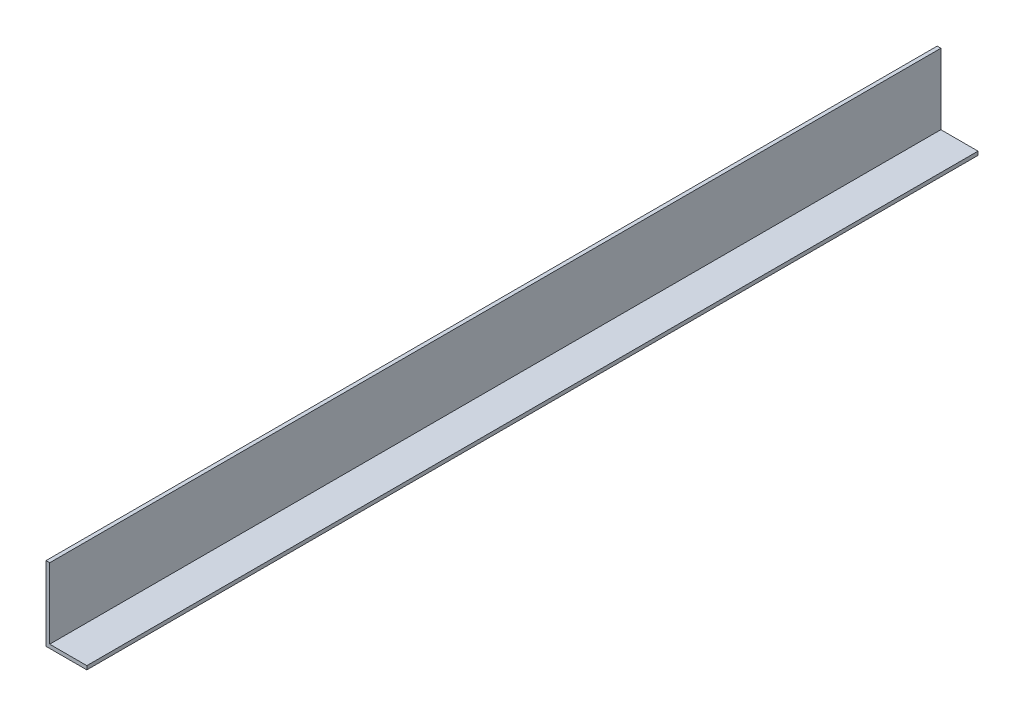
ISO-10303-21;
HEADER;
FILE_DESCRIPTION(('STEP AP214'),'2;1');
FILE_NAME('part.step','',(''),(''),'','','');
FILE_SCHEMA(('AUTOMOTIVE_DESIGN { 1 0 10303 214 1 1 1 1 }'));
ENDSEC;
DATA;
#1=APPLICATION_CONTEXT('core data for automotive mechanical design processes');
#2=APPLICATION_PROTOCOL_DEFINITION('international standard','automotive_design',2000,#1);
#3=PRODUCT_CONTEXT('',#1,'mechanical');
#4=PRODUCT('Part','Part','',(#3));
#5=PRODUCT_RELATED_PRODUCT_CATEGORY('part','',(#4));
#6=PRODUCT_DEFINITION_FORMATION('','',#4);
#7=PRODUCT_DEFINITION_CONTEXT('part definition',#1,'design');
#8=PRODUCT_DEFINITION('design','',#6,#7);
#9=PRODUCT_DEFINITION_SHAPE('','',#8);
#10=(LENGTH_UNIT() NAMED_UNIT(*) SI_UNIT(.MILLI.,.METRE.));
#11=(NAMED_UNIT(*) PLANE_ANGLE_UNIT() SI_UNIT($,.RADIAN.));
#12=(NAMED_UNIT(*) SI_UNIT($,.STERADIAN.) SOLID_ANGLE_UNIT());
#13=UNCERTAINTY_MEASURE_WITH_UNIT(LENGTH_MEASURE(1.E-05),#10,'distance_accuracy_value','');
#14=(GEOMETRIC_REPRESENTATION_CONTEXT(3) GLOBAL_UNCERTAINTY_ASSIGNED_CONTEXT((#13)) GLOBAL_UNIT_ASSIGNED_CONTEXT((#10,
#11,#12)) REPRESENTATION_CONTEXT('',''));
#15=CARTESIAN_POINT('',(0.,0.,0.));
#16=DIRECTION('',(0.,0.,1.));
#17=DIRECTION('',(1.,0.,0.));
#18=AXIS2_PLACEMENT_3D('',#15,#16,#17);
#19=CARTESIAN_POINT('',(11.,0.,240.));
#20=DIRECTION('',(0.,1.,0.));
#21=DIRECTION('',(-1.,0.,0.));
#22=AXIS2_PLACEMENT_3D('',#19,#20,#21);
#23=PLANE('',#22);
#24=DIRECTION('',(1.,0.,0.));
#25=VECTOR('',#24,1.);
#26=CARTESIAN_POINT('',(11.,0.,0.));
#27=LINE('',#26,#25);
#28=CARTESIAN_POINT('',(0.,0.,0.));
#29=VERTEX_POINT('',#28);
#30=CARTESIAN_POINT('',(11.,0.,0.));
#31=VERTEX_POINT('',#30);
#32=EDGE_CURVE('E117',#29,#31,#27,.T.);
#33=ORIENTED_EDGE('',*,*,#32,.T.);
#34=DIRECTION('',(0.,0.,-1.));
#35=VECTOR('',#34,1.);
#36=CARTESIAN_POINT('',(11.,0.,240.));
#37=LINE('',#36,#35);
#38=CARTESIAN_POINT('',(11.,0.,240.));
#39=VERTEX_POINT('',#38);
#40=EDGE_CURVE('E11',#39,#31,#37,.T.);
#41=ORIENTED_EDGE('',*,*,#40,.F.);
#42=DIRECTION('',(1.,0.,0.));
#43=VECTOR('',#42,1.);
#44=CARTESIAN_POINT('',(11.,0.,240.));
#45=LINE('',#44,#43);
#46=CARTESIAN_POINT('',(0.,0.,240.));
#47=VERTEX_POINT('',#46);
#48=EDGE_CURVE('E127',#47,#39,#45,.T.);
#49=ORIENTED_EDGE('',*,*,#48,.F.);
#50=DIRECTION('',(0.,0.,-1.));
#51=VECTOR('',#50,1.);
#52=CARTESIAN_POINT('',(0.,0.,240.));
#53=LINE('',#52,#51);
#54=EDGE_CURVE('E113',#47,#29,#53,.T.);
#55=ORIENTED_EDGE('',*,*,#54,.T.);
#56=EDGE_LOOP('',(#33,#41,#49,#55));
#57=FACE_BOUND('',#56,.T.);
#58=ADVANCED_FACE('F33',(#57),#23,.F.);
#59=CARTESIAN_POINT('',(11.,0.999999999999999,240.));
#60=DIRECTION('',(-1.,0.,0.));
#61=DIRECTION('',(0.,0.,1.));
#62=AXIS2_PLACEMENT_3D('',#59,#60,#61);
#63=PLANE('',#62);
#64=DIRECTION('',(0.,1.,0.));
#65=VECTOR('',#64,1.);
#66=CARTESIAN_POINT('',(11.,0.999999999999999,0.));
#67=LINE('',#66,#65);
#68=CARTESIAN_POINT('',(11.,0.999999999999999,0.));
#69=VERTEX_POINT('',#68);
#70=EDGE_CURVE('E120',#31,#69,#67,.T.);
#71=ORIENTED_EDGE('',*,*,#70,.T.);
#72=DIRECTION('',(0.,0.,-1.));
#73=VECTOR('',#72,1.);
#74=CARTESIAN_POINT('',(11.,0.999999999999999,240.));
#75=LINE('',#74,#73);
#76=CARTESIAN_POINT('',(11.,0.999999999999999,240.));
#77=VERTEX_POINT('',#76);
#78=EDGE_CURVE('E41',#77,#69,#75,.T.);
#79=ORIENTED_EDGE('',*,*,#78,.F.);
#80=DIRECTION('',(0.,1.,0.));
#81=VECTOR('',#80,1.);
#82=CARTESIAN_POINT('',(11.,0.999999999999999,240.));
#83=LINE('',#82,#81);
#84=EDGE_CURVE('E86',#39,#77,#83,.T.);
#85=ORIENTED_EDGE('',*,*,#84,.F.);
#86=ORIENTED_EDGE('',*,*,#40,.T.);
#87=EDGE_LOOP('',(#71,#79,#85,#86));
#88=FACE_BOUND('',#87,.T.);
#89=ADVANCED_FACE('F151',(#88),#63,.F.);
#90=CARTESIAN_POINT('',(1.,1.,240.));
#91=DIRECTION('',(0.,-1.,0.));
#92=DIRECTION('',(1.,0.,0.));
#93=AXIS2_PLACEMENT_3D('',#90,#91,#92);
#94=PLANE('',#93);
#95=DIRECTION('',(-1.,0.,0.));
#96=VECTOR('',#95,1.);
#97=CARTESIAN_POINT('',(1.,1.,0.));
#98=LINE('',#97,#96);
#99=CARTESIAN_POINT('',(1.,1.,0.));
#100=VERTEX_POINT('',#99);
#101=EDGE_CURVE('E122',#69,#100,#98,.T.);
#102=ORIENTED_EDGE('',*,*,#101,.T.);
#103=DIRECTION('',(0.,0.,-1.));
#104=VECTOR('',#103,1.);
#105=CARTESIAN_POINT('',(1.,1.,240.));
#106=LINE('',#105,#104);
#107=CARTESIAN_POINT('',(1.,1.,240.));
#108=VERTEX_POINT('',#107);
#109=EDGE_CURVE('E108',#108,#100,#106,.T.);
#110=ORIENTED_EDGE('',*,*,#109,.F.);
#111=DIRECTION('',(-1.,0.,0.));
#112=VECTOR('',#111,1.);
#113=CARTESIAN_POINT('',(1.,1.,240.));
#114=LINE('',#113,#112);
#115=EDGE_CURVE('E99',#77,#108,#114,.T.);
#116=ORIENTED_EDGE('',*,*,#115,.F.);
#117=ORIENTED_EDGE('',*,*,#78,.T.);
#118=EDGE_LOOP('',(#102,#110,#116,#117));
#119=FACE_BOUND('',#118,.T.);
#120=ADVANCED_FACE('F133',(#119),#94,.F.);
#121=CARTESIAN_POINT('',(1.,20.,240.));
#122=DIRECTION('',(-1.,0.,0.));
#123=DIRECTION('',(0.,-1.,0.));
#124=AXIS2_PLACEMENT_3D('',#121,#122,#123);
#125=PLANE('',#124);
#126=DIRECTION('',(0.,1.,0.));
#127=VECTOR('',#126,1.);
#128=CARTESIAN_POINT('',(1.,20.,0.));
#129=LINE('',#128,#127);
#130=CARTESIAN_POINT('',(1.,20.,0.));
#131=VERTEX_POINT('',#130);
#132=EDGE_CURVE('E107',#100,#131,#129,.T.);
#133=ORIENTED_EDGE('',*,*,#132,.T.);
#134=DIRECTION('',(0.,0.,-1.));
#135=VECTOR('',#134,1.);
#136=CARTESIAN_POINT('',(1.,20.,240.));
#137=LINE('',#136,#135);
#138=CARTESIAN_POINT('',(1.,20.,240.));
#139=VERTEX_POINT('',#138);
#140=EDGE_CURVE('E104',#139,#131,#137,.T.);
#141=ORIENTED_EDGE('',*,*,#140,.F.);
#142=DIRECTION('',(0.,1.,0.));
#143=VECTOR('',#142,1.);
#144=CARTESIAN_POINT('',(1.,20.,240.));
#145=LINE('',#144,#143);
#146=EDGE_CURVE('E93',#108,#139,#145,.T.);
#147=ORIENTED_EDGE('',*,*,#146,.F.);
#148=ORIENTED_EDGE('',*,*,#109,.T.);
#149=EDGE_LOOP('',(#133,#141,#147,#148));
#150=FACE_BOUND('',#149,.T.);
#151=ADVANCED_FACE('F105',(#150),#125,.F.);
#152=CARTESIAN_POINT('',(0.,20.,240.));
#153=DIRECTION('',(0.,-1.,0.));
#154=DIRECTION('',(0.,0.,-1.));
#155=AXIS2_PLACEMENT_3D('',#152,#153,#154);
#156=PLANE('',#155);
#157=DIRECTION('',(-1.,0.,0.));
#158=VECTOR('',#157,1.);
#159=CARTESIAN_POINT('',(0.,20.,0.));
#160=LINE('',#159,#158);
#161=CARTESIAN_POINT('',(0.,20.,0.));
#162=VERTEX_POINT('',#161);
#163=EDGE_CURVE('E72',#131,#162,#160,.T.);
#164=ORIENTED_EDGE('',*,*,#163,.T.);
#165=DIRECTION('',(0.,0.,-1.));
#166=VECTOR('',#165,1.);
#167=CARTESIAN_POINT('',(0.,20.,240.));
#168=LINE('',#167,#166);
#169=CARTESIAN_POINT('',(0.,20.,240.));
#170=VERTEX_POINT('',#169);
#171=EDGE_CURVE('E109',#170,#162,#168,.T.);
#172=ORIENTED_EDGE('',*,*,#171,.F.);
#173=DIRECTION('',(-1.,0.,0.));
#174=VECTOR('',#173,1.);
#175=CARTESIAN_POINT('',(0.,20.,240.));
#176=LINE('',#175,#174);
#177=EDGE_CURVE('E97',#139,#170,#176,.T.);
#178=ORIENTED_EDGE('',*,*,#177,.F.);
#179=ORIENTED_EDGE('',*,*,#140,.T.);
#180=EDGE_LOOP('',(#164,#172,#178,#179));
#181=FACE_BOUND('',#180,.T.);
#182=ADVANCED_FACE('F111',(#181),#156,.F.);
#183=CARTESIAN_POINT('',(0.,0.,240.));
#184=DIRECTION('',(1.,0.,0.));
#185=DIRECTION('',(0.,0.,-1.));
#186=AXIS2_PLACEMENT_3D('',#183,#184,#185);
#187=PLANE('',#186);
#188=DIRECTION('',(0.,-1.,0.));
#189=VECTOR('',#188,1.);
#190=CARTESIAN_POINT('',(0.,0.,0.));
#191=LINE('',#190,#189);
#192=EDGE_CURVE('E78',#162,#29,#191,.T.);
#193=ORIENTED_EDGE('',*,*,#192,.T.);
#194=ORIENTED_EDGE('',*,*,#54,.F.);
#195=DIRECTION('',(0.,-1.,0.));
#196=VECTOR('',#195,1.);
#197=CARTESIAN_POINT('',(0.,0.,240.));
#198=LINE('',#197,#196);
#199=EDGE_CURVE('E49',#170,#47,#198,.T.);
#200=ORIENTED_EDGE('',*,*,#199,.F.);
#201=ORIENTED_EDGE('',*,*,#171,.T.);
#202=EDGE_LOOP('',(#193,#194,#200,#201));
#203=FACE_BOUND('',#202,.T.);
#204=ADVANCED_FACE('F140',(#203),#187,.F.);
#205=CARTESIAN_POINT('',(0.,0.,240.));
#206=DIRECTION('',(0.,0.,-1.));
#207=DIRECTION('',(-1.,0.,0.));
#208=AXIS2_PLACEMENT_3D('',#205,#206,#207);
#209=PLANE('',#208);
#210=ORIENTED_EDGE('',*,*,#48,.T.);
#211=ORIENTED_EDGE('',*,*,#84,.T.);
#212=ORIENTED_EDGE('',*,*,#115,.T.);
#213=ORIENTED_EDGE('',*,*,#146,.T.);
#214=ORIENTED_EDGE('',*,*,#177,.T.);
#215=ORIENTED_EDGE('',*,*,#199,.T.);
#216=EDGE_LOOP('',(#210,#211,#212,#213,#214,#215));
#217=FACE_BOUND('',#216,.T.);
#218=ADVANCED_FACE('F95',(#217),#209,.F.);
#219=CARTESIAN_POINT('',(0.,0.,0.));
#220=DIRECTION('',(0.,0.,-1.));
#221=DIRECTION('',(-1.,0.,0.));
#222=AXIS2_PLACEMENT_3D('',#219,#220,#221);
#223=PLANE('',#222);
#224=ORIENTED_EDGE('',*,*,#32,.F.);
#225=ORIENTED_EDGE('',*,*,#192,.F.);
#226=ORIENTED_EDGE('',*,*,#163,.F.);
#227=ORIENTED_EDGE('',*,*,#132,.F.);
#228=ORIENTED_EDGE('',*,*,#101,.F.);
#229=ORIENTED_EDGE('',*,*,#70,.F.);
#230=EDGE_LOOP('',(#224,#225,#226,#227,#228,#229));
#231=FACE_BOUND('',#230,.T.);
#232=ADVANCED_FACE('F136',(#231),#223,.T.);
#233=CLOSED_SHELL('',(#58,#89,#120,#151,#182,#204,#218,#232));
#234=MANIFOLD_SOLID_BREP('B2',#233);
#235=ADVANCED_BREP_SHAPE_REPRESENTATION('',(#18,#234),#14);
#236=SHAPE_DEFINITION_REPRESENTATION(#9,#235);
ENDSEC;
END-ISO-10303-21;
